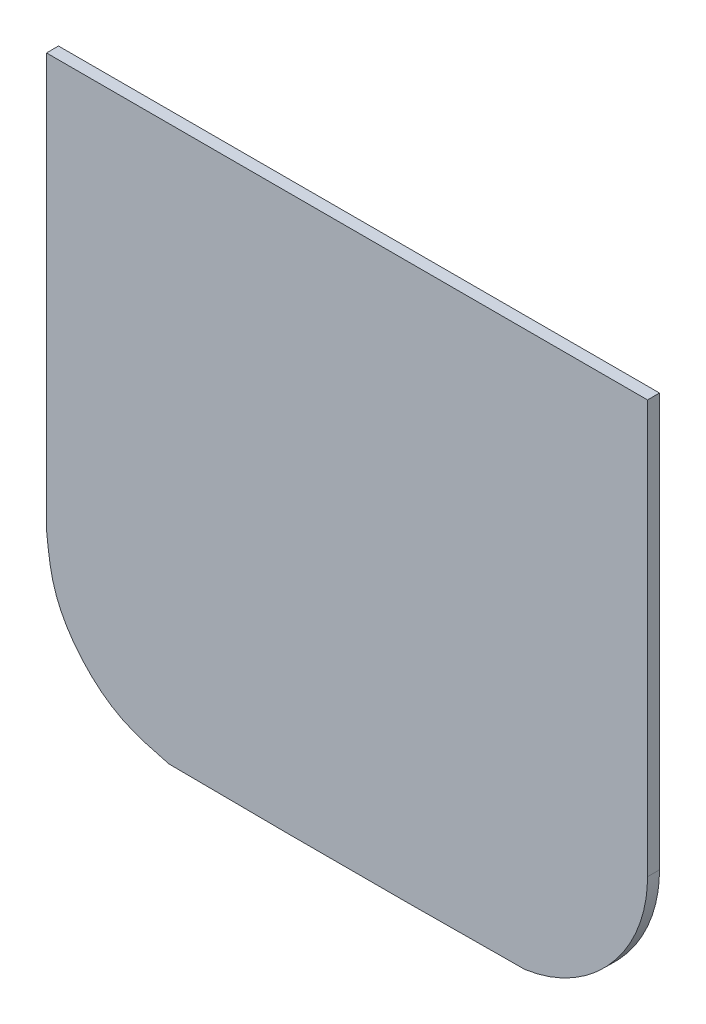
ISO-10303-21;
HEADER;
FILE_DESCRIPTION(('STEP AP214'),'2;1');
FILE_NAME('part.step','',(''),(''),'','','');
FILE_SCHEMA(('AUTOMOTIVE_DESIGN { 1 0 10303 214 1 1 1 1 }'));
ENDSEC;
DATA;
#1=APPLICATION_CONTEXT('core data for automotive mechanical design processes');
#2=APPLICATION_PROTOCOL_DEFINITION('international standard','automotive_design',2000,#1);
#3=PRODUCT_CONTEXT('',#1,'mechanical');
#4=PRODUCT('Part','Part','',(#3));
#5=PRODUCT_RELATED_PRODUCT_CATEGORY('part','',(#4));
#6=PRODUCT_DEFINITION_FORMATION('','',#4);
#7=PRODUCT_DEFINITION_CONTEXT('part definition',#1,'design');
#8=PRODUCT_DEFINITION('design','',#6,#7);
#9=PRODUCT_DEFINITION_SHAPE('','',#8);
#10=(LENGTH_UNIT() NAMED_UNIT(*) SI_UNIT(.MILLI.,.METRE.));
#11=(NAMED_UNIT(*) PLANE_ANGLE_UNIT() SI_UNIT($,.RADIAN.));
#12=(NAMED_UNIT(*) SI_UNIT($,.STERADIAN.) SOLID_ANGLE_UNIT());
#13=UNCERTAINTY_MEASURE_WITH_UNIT(LENGTH_MEASURE(1.E-05),#10,'distance_accuracy_value','');
#14=(GEOMETRIC_REPRESENTATION_CONTEXT(3) GLOBAL_UNCERTAINTY_ASSIGNED_CONTEXT((#13)) GLOBAL_UNIT_ASSIGNED_CONTEXT((#10,
#11,#12)) REPRESENTATION_CONTEXT('',''));
#15=CARTESIAN_POINT('',(0.,0.,0.));
#16=DIRECTION('',(0.,0.,1.));
#17=DIRECTION('',(1.,0.,0.));
#18=AXIS2_PLACEMENT_3D('',#15,#16,#17);
#19=CARTESIAN_POINT('',(-15.586513403521,-43.4972768358654,63.3775376608099));
#20=CARTESIAN_POINT('',(-15.4948712922636,-44.3805286265231,63.3775376608099));
#21=CARTESIAN_POINT('',(-15.3115978698163,-46.1469281161845,63.3775376608099));
#22=CARTESIAN_POINT('',(-13.8850438490819,-48.4466665045707,63.3775376608099));
#23=CARTESIAN_POINT('',(-11.814804123514,-50.1899535354438,63.3775376608099));
#24=CARTESIAN_POINT('',(-10.0930813717558,-50.6254290465982,63.3775376608099));
#25=CARTESIAN_POINT('',(-9.23206602242436,-50.8432057466964,63.3775376608099));
#26=CARTESIAN_POINT('',(-9.19763182855284,-50.8519151908634,63.3775376608099));
#27=CARTESIAN_POINT('',(-9.16319763468133,-50.8606246350303,63.3775376608099));
#28=CARTESIAN_POINT('',(-9.12876344080981,-50.8693340791973,63.3775376608099));
#29=B_SPLINE_CURVE_WITH_KNOTS('',3,(#19,#20,#21,#22,#23,#24,#25,#26,#27,#28),.UNSPECIFIED.,.F.,
.F.,(4,1,1,1,3,4),(0.,0.250012835960395,0.499996207786223,0.749953388615937,1.,1.01),.UNSPECIFIED.);
#30=DIRECTION('',(0.,0.,1.));
#31=VECTOR('',#30,1.);
#32=SURFACE_OF_LINEAR_EXTRUSION('',#29,#31);
#33=CARTESIAN_POINT('',(-9.232066066628,-50.843205735516,63.999));
#34=CARTESIAN_POINT('',(-10.0930814012249,-50.6254290391446,63.999));
#35=CARTESIAN_POINT('',(-11.8148041353257,-50.1899535254975,63.999));
#36=CARTESIAN_POINT('',(-13.8850438490819,-48.4466665045707,63.999));
#37=CARTESIAN_POINT('',(-15.3115978698163,-46.1469281161845,63.999));
#38=CARTESIAN_POINT('',(-15.4948712922636,-44.3805286265231,63.999));
#39=CARTESIAN_POINT('',(-15.586513403521,-43.4972768358654,63.999));
#40=B_SPLINE_CURVE_WITH_KNOTS('',3,(#33,#34,#35,#36,#37,#38,#39),.UNSPECIFIED.,.F.,.F.,(4,1,1,1,
4),(0.,0.250046607105018,0.500003787934732,0.74998715976056,0.999999995720955),.UNSPECIFIED.);
#41=CARTESIAN_POINT('',(-15.586513403521,-43.4972768358654,63.999));
#42=VERTEX_POINT('',#41);
#43=CARTESIAN_POINT('',(-9.23206534012727,-50.843233075379,63.999));
#44=VERTEX_POINT('',#43);
#45=EDGE_CURVE('E113',#42,#44,#40,.F.);
#46=ORIENTED_EDGE('',*,*,#45,.F.);
#47=CARTESIAN_POINT('',(-15.586513403521,-43.4972768358654,63.999));
#48=DIRECTION('',(0.,0.,-1.));
#49=VECTOR('',#48,1.);
#50=LINE('',#47,#49);
#51=CARTESIAN_POINT('',(-15.586513403521,-43.4972768358654,63.3775376608099));
#52=VERTEX_POINT('',#51);
#53=EDGE_CURVE('E36',#52,#42,#50,.F.);
#54=ORIENTED_EDGE('',*,*,#53,.F.);
#55=CARTESIAN_POINT('',(-15.586513403521,-43.4972768358654,63.3775376608099));
#56=CARTESIAN_POINT('',(-15.4948712922636,-44.3805286265231,63.3775376608099));
#57=CARTESIAN_POINT('',(-15.3115978698163,-46.1469281161845,63.3775376608099));
#58=CARTESIAN_POINT('',(-13.8850438490819,-48.4466665045707,63.3775376608099));
#59=CARTESIAN_POINT('',(-11.8148041353257,-50.1899535254975,63.3775376608099));
#60=CARTESIAN_POINT('',(-10.0930814012249,-50.6254290391446,63.3775376608099));
#61=CARTESIAN_POINT('',(-9.232066066628,-50.843205735516,63.3775376608099));
#62=B_SPLINE_CURVE_WITH_KNOTS('',3,(#55,#56,#57,#58,#59,#60,#61),.UNSPECIFIED.,.F.,.F.,(4,1,1,1,
4),(0.,0.250012835960395,0.499996207786223,0.749953388615937,0.999999995720955),.UNSPECIFIED.);
#63=CARTESIAN_POINT('',(-9.23206534012727,-50.843233075379,63.3775376608099));
#64=VERTEX_POINT('',#63);
#65=EDGE_CURVE('E183',#52,#64,#62,.T.);
#66=ORIENTED_EDGE('',*,*,#65,.T.);
#67=CARTESIAN_POINT('',(-9.2320588845186,-50.8432075520877,63.3775376608099));
#68=DIRECTION('',(0.,0.,1.));
#69=VECTOR('',#68,1.);
#70=LINE('',#67,#69);
#71=EDGE_CURVE('E10',#64,#44,#70,.T.);
#72=ORIENTED_EDGE('',*,*,#71,.T.);
#73=EDGE_LOOP('',(#46,#54,#66,#72));
#74=FACE_BOUND('',#73,.T.);
#75=ADVANCED_FACE('F16',(#74),#32,.T.);
#76=CARTESIAN_POINT('',(-9.289859231082,-50.8426151107216,63.3775376608099));
#77=CARTESIAN_POINT('',(-3.0998886639416,-50.9090108257044,63.3775376608099));
#78=CARTESIAN_POINT('',(3.09990667891525,-50.908328158536,63.3775376608096));
#79=CARTESIAN_POINT('',(9.28988461426709,-50.8426244176335,63.3775376608099));
#80=B_SPLINE_CURVE_WITH_KNOTS('',3,(#76,#77,#78,#79),.UNSPECIFIED.,.F.,.F.,(4,4),(0.,
1.00943989790976),.UNSPECIFIED.);
#81=DIRECTION('',(0.,0.,1.));
#82=VECTOR('',#81,1.);
#83=SURFACE_OF_LINEAR_EXTRUSION('',#80,#82);
#84=CARTESIAN_POINT('',(-9.289859231082,-50.8426151107216,63.999));
#85=CARTESIAN_POINT('',(-3.0998886639416,-50.9090108257044,63.999));
#86=CARTESIAN_POINT('',(3.09990667891525,-50.908328158536,63.9989999999997));
#87=CARTESIAN_POINT('',(9.28988461426709,-50.8426244176335,63.999));
#88=B_SPLINE_CURVE_WITH_KNOTS('',3,(#84,#85,#86,#87),.UNSPECIFIED.,.F.,.F.,(4,4),(0.,
1.00943989790976),.UNSPECIFIED.);
#89=CARTESIAN_POINT('',(9.2319416091347,-50.843237553494,63.999));
#90=VERTEX_POINT('',#89);
#91=EDGE_CURVE('E118',#44,#90,#88,.T.);
#92=ORIENTED_EDGE('',*,*,#91,.F.);
#93=ORIENTED_EDGE('',*,*,#71,.F.);
#94=CARTESIAN_POINT('',(9.2319416091347,-50.843237553494,63.3775376608099));
#95=VERTEX_POINT('',#94);
#96=EDGE_CURVE('E173',#64,#95,#80,.T.);
#97=ORIENTED_EDGE('',*,*,#96,.T.);
#98=CARTESIAN_POINT('',(9.23194160918124,-50.8432375535015,63.3775376608099));
#99=DIRECTION('',(0.,0.,1.));
#100=VECTOR('',#99,1.);
#101=LINE('',#98,#100);
#102=EDGE_CURVE('E28',#95,#90,#101,.T.);
#103=ORIENTED_EDGE('',*,*,#102,.T.);
#104=EDGE_LOOP('',(#92,#93,#97,#103));
#105=FACE_BOUND('',#104,.T.);
#106=ADVANCED_FACE('F162',(#105),#83,.T.);
#107=CARTESIAN_POINT('',(9.17479959991945,-50.85116791629,63.3775376608099));
#108=CARTESIAN_POINT('',(12.6756807856699,-50.3762998206461,63.3775376608099));
#109=CARTESIAN_POINT('',(15.586513403521,-47.0768177207195,63.3775376608099));
#110=CARTESIAN_POINT('',(15.586513403521,-43.4972768358654,63.3775376608099));
#111=B_SPLINE_CURVE_WITH_KNOTS('',3,(#107,#108,#109,#110),.UNSPECIFIED.,.F.,.F.,(4,4),(0.,
1.00823974609375),.UNSPECIFIED.);
#112=DIRECTION('',(0.,0.,1.));
#113=VECTOR('',#112,1.);
#114=SURFACE_OF_LINEAR_EXTRUSION('',#111,#113);
#115=CARTESIAN_POINT('',(9.17479959991945,-50.85116791629,63.999));
#116=CARTESIAN_POINT('',(12.6756807856699,-50.3762998206461,63.999));
#117=CARTESIAN_POINT('',(15.586513403521,-47.0768177207195,63.999));
#118=CARTESIAN_POINT('',(15.586513403521,-43.4972768358654,63.999));
#119=B_SPLINE_CURVE_WITH_KNOTS('',3,(#115,#116,#117,#118),.UNSPECIFIED.,.F.,.F.,(4,4),(0.,
1.00823974609375),.UNSPECIFIED.);
#120=CARTESIAN_POINT('',(15.586513403521,-43.4972768358654,63.999));
#121=VERTEX_POINT('',#120);
#122=EDGE_CURVE('E216',#90,#121,#119,.T.);
#123=ORIENTED_EDGE('',*,*,#122,.F.);
#124=ORIENTED_EDGE('',*,*,#102,.F.);
#125=CARTESIAN_POINT('',(15.586513403521,-43.4972768358654,63.3775376608099));
#126=VERTEX_POINT('',#125);
#127=EDGE_CURVE('E98',#95,#126,#111,.T.);
#128=ORIENTED_EDGE('',*,*,#127,.T.);
#129=DIRECTION('',(0.,0.,1.));
#130=VECTOR('',#129,1.);
#131=CARTESIAN_POINT('',(15.586513403521,-43.4972768358654,63.3775376608099));
#132=LINE('',#131,#130);
#133=EDGE_CURVE('E90',#126,#121,#132,.T.);
#134=ORIENTED_EDGE('',*,*,#133,.T.);
#135=EDGE_LOOP('',(#123,#124,#128,#134));
#136=FACE_BOUND('',#135,.T.);
#137=ADVANCED_FACE('F154',(#136),#114,.T.);
#138=CARTESIAN_POINT('',(15.586513403521,-43.4972768358654,63.3775376608099));
#139=DIRECTION('',(1.,0.,0.));
#140=DIRECTION('',(0.,1.,0.));
#141=AXIS2_PLACEMENT_3D('',#138,#139,#140);
#142=PLANE('',#141);
#143=DIRECTION('',(0.,1.,0.));
#144=VECTOR('',#143,1.);
#145=CARTESIAN_POINT('',(15.586513403521,-43.4972768358654,63.999));
#146=LINE('',#145,#144);
#147=CARTESIAN_POINT('',(15.586513403521,-22.0792374845821,63.999));
#148=VERTEX_POINT('',#147);
#149=EDGE_CURVE('E195',#121,#148,#146,.T.);
#150=ORIENTED_EDGE('',*,*,#149,.F.);
#151=ORIENTED_EDGE('',*,*,#133,.F.);
#152=DIRECTION('',(0.,1.,0.));
#153=VECTOR('',#152,1.);
#154=CARTESIAN_POINT('',(15.586513403521,-43.4972768358654,63.3775376608099));
#155=LINE('',#154,#153);
#156=CARTESIAN_POINT('',(15.586513403521,-22.0792374845821,63.3775376608099));
#157=VERTEX_POINT('',#156);
#158=EDGE_CURVE('E93',#126,#157,#155,.T.);
#159=ORIENTED_EDGE('',*,*,#158,.T.);
#160=DIRECTION('',(0.,0.,1.));
#161=VECTOR('',#160,1.);
#162=CARTESIAN_POINT('',(15.586513403521,-22.0792374845821,63.3775376608099));
#163=LINE('',#162,#161);
#164=EDGE_CURVE('E79',#157,#148,#163,.T.);
#165=ORIENTED_EDGE('',*,*,#164,.T.);
#166=EDGE_LOOP('',(#150,#151,#159,#165));
#167=FACE_BOUND('',#166,.T.);
#168=ADVANCED_FACE('F94',(#167),#142,.T.);
#169=CARTESIAN_POINT('',(15.586513403521,-22.0792374845821,63.3775376608099));
#170=DIRECTION('',(0.,1.,0.));
#171=DIRECTION('',(-1.,0.,0.));
#172=AXIS2_PLACEMENT_3D('',#169,#170,#171);
#173=PLANE('',#172);
#174=DIRECTION('',(-1.,0.,0.));
#175=VECTOR('',#174,1.);
#176=CARTESIAN_POINT('',(15.586513403521,-22.0792374845821,63.999));
#177=LINE('',#176,#175);
#178=CARTESIAN_POINT('',(-15.586513403521,-22.0792374845821,63.999));
#179=VERTEX_POINT('',#178);
#180=EDGE_CURVE('E86',#148,#179,#177,.T.);
#181=ORIENTED_EDGE('',*,*,#180,.F.);
#182=ORIENTED_EDGE('',*,*,#164,.F.);
#183=DIRECTION('',(-1.,0.,0.));
#184=VECTOR('',#183,1.);
#185=CARTESIAN_POINT('',(15.586513403521,-22.0792374845821,63.3775376608099));
#186=LINE('',#185,#184);
#187=CARTESIAN_POINT('',(-15.586513403521,-22.0792374845821,63.3775376608099));
#188=VERTEX_POINT('',#187);
#189=EDGE_CURVE('E83',#157,#188,#186,.T.);
#190=ORIENTED_EDGE('',*,*,#189,.T.);
#191=DIRECTION('',(0.,0.,1.));
#192=VECTOR('',#191,1.);
#193=CARTESIAN_POINT('',(-15.586513403521,-22.0792374845821,63.3775376608099));
#194=LINE('',#193,#192);
#195=EDGE_CURVE('E59',#188,#179,#194,.T.);
#196=ORIENTED_EDGE('',*,*,#195,.T.);
#197=EDGE_LOOP('',(#181,#182,#190,#196));
#198=FACE_BOUND('',#197,.T.);
#199=ADVANCED_FACE('F81',(#198),#173,.T.);
#200=CARTESIAN_POINT('',(-15.586513403521,-22.0792374845821,63.3775376608099));
#201=DIRECTION('',(-1.,0.,0.));
#202=DIRECTION('',(0.,-1.,0.));
#203=AXIS2_PLACEMENT_3D('',#200,#201,#202);
#204=PLANE('',#203);
#205=DIRECTION('',(0.,-1.,0.));
#206=VECTOR('',#205,1.);
#207=CARTESIAN_POINT('',(-15.586513403521,-22.0792374845821,63.999));
#208=LINE('',#207,#206);
#209=EDGE_CURVE('E193',#179,#42,#208,.T.);
#210=ORIENTED_EDGE('',*,*,#209,.F.);
#211=ORIENTED_EDGE('',*,*,#195,.F.);
#212=DIRECTION('',(0.,-1.,0.));
#213=VECTOR('',#212,1.);
#214=CARTESIAN_POINT('',(-15.586513403521,-22.0792374845821,63.3775376608099));
#215=LINE('',#214,#213);
#216=EDGE_CURVE('E102',#188,#52,#215,.T.);
#217=ORIENTED_EDGE('',*,*,#216,.T.);
#218=ORIENTED_EDGE('',*,*,#53,.T.);
#219=EDGE_LOOP('',(#210,#211,#217,#218));
#220=FACE_BOUND('',#219,.T.);
#221=ADVANCED_FACE('F131',(#220),#204,.T.);
#222=CARTESIAN_POINT('',(-2.07940953553081E-05,-50.4740642158645,63.3775376608099));
#223=DIRECTION('',(0.,0.,1.));
#224=DIRECTION('',(0.,-1.,0.));
#225=AXIS2_PLACEMENT_3D('',#222,#223,#224);
#226=PLANE('',#225);
#227=ORIENTED_EDGE('',*,*,#65,.F.);
#228=ORIENTED_EDGE('',*,*,#216,.F.);
#229=ORIENTED_EDGE('',*,*,#189,.F.);
#230=ORIENTED_EDGE('',*,*,#158,.F.);
#231=ORIENTED_EDGE('',*,*,#127,.F.);
#232=ORIENTED_EDGE('',*,*,#96,.F.);
#233=EDGE_LOOP('',(#227,#228,#229,#230,#231,#232));
#234=FACE_BOUND('',#233,.T.);
#235=ADVANCED_FACE('F101',(#234),#226,.F.);
#236=CARTESIAN_POINT('',(-2.07940953553254E-05,-50.4740642158645,63.999));
#237=DIRECTION('',(0.,0.,1.));
#238=DIRECTION('',(0.,-1.,0.));
#239=AXIS2_PLACEMENT_3D('',#236,#237,#238);
#240=PLANE('',#239);
#241=ORIENTED_EDGE('',*,*,#45,.T.);
#242=ORIENTED_EDGE('',*,*,#91,.T.);
#243=ORIENTED_EDGE('',*,*,#122,.T.);
#244=ORIENTED_EDGE('',*,*,#149,.T.);
#245=ORIENTED_EDGE('',*,*,#180,.T.);
#246=ORIENTED_EDGE('',*,*,#209,.T.);
#247=EDGE_LOOP('',(#241,#242,#243,#244,#245,#246));
#248=FACE_BOUND('',#247,.T.);
#249=ADVANCED_FACE('F120',(#248),#240,.T.);
#250=CLOSED_SHELL('',(#75,#106,#137,#168,#199,#221,#235,#249));
#251=MANIFOLD_SOLID_BREP('B1',#250);
#252=ADVANCED_BREP_SHAPE_REPRESENTATION('',(#18,#251),#14);
#253=SHAPE_DEFINITION_REPRESENTATION(#9,#252);
ENDSEC;
END-ISO-10303-21;
